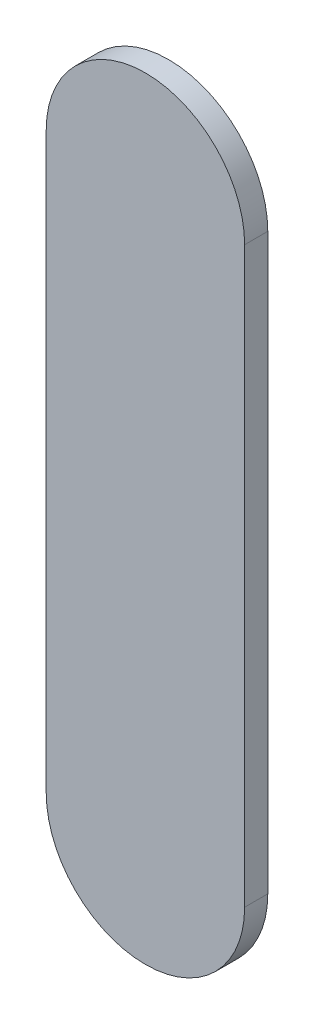
ISO-10303-21;
HEADER;
FILE_DESCRIPTION(('STEP AP214'),'2;1');
FILE_NAME('part.step','',(''),(''),'','','');
FILE_SCHEMA(('AUTOMOTIVE_DESIGN { 1 0 10303 214 1 1 1 1 }'));
ENDSEC;
DATA;
#1=APPLICATION_CONTEXT('core data for automotive mechanical design processes');
#2=APPLICATION_PROTOCOL_DEFINITION('international standard','automotive_design',2000,#1);
#3=PRODUCT_CONTEXT('',#1,'mechanical');
#4=PRODUCT('Part','Part','',(#3));
#5=PRODUCT_RELATED_PRODUCT_CATEGORY('part','',(#4));
#6=PRODUCT_DEFINITION_FORMATION('','',#4);
#7=PRODUCT_DEFINITION_CONTEXT('part definition',#1,'design');
#8=PRODUCT_DEFINITION('design','',#6,#7);
#9=PRODUCT_DEFINITION_SHAPE('','',#8);
#10=(LENGTH_UNIT() NAMED_UNIT(*) SI_UNIT(.MILLI.,.METRE.));
#11=(NAMED_UNIT(*) PLANE_ANGLE_UNIT() SI_UNIT($,.RADIAN.));
#12=(NAMED_UNIT(*) SI_UNIT($,.STERADIAN.) SOLID_ANGLE_UNIT());
#13=UNCERTAINTY_MEASURE_WITH_UNIT(LENGTH_MEASURE(1.E-05),#10,'distance_accuracy_value','');
#14=(GEOMETRIC_REPRESENTATION_CONTEXT(3) GLOBAL_UNCERTAINTY_ASSIGNED_CONTEXT((#13)) GLOBAL_UNIT_ASSIGNED_CONTEXT((#10,
#11,#12)) REPRESENTATION_CONTEXT('',''));
#15=CARTESIAN_POINT('',(0.,0.,0.));
#16=DIRECTION('',(0.,0.,1.));
#17=DIRECTION('',(1.,0.,0.));
#18=AXIS2_PLACEMENT_3D('',#15,#16,#17);
#19=CARTESIAN_POINT('',(125.15,-61.5875,1.635));
#20=DIRECTION('',(0.,0.,1.));
#21=DIRECTION('',(1.,0.,0.));
#22=AXIS2_PLACEMENT_3D('',#19,#20,#21);
#23=PLANE('',#22);
#24=DIRECTION('',(0.,1.,0.));
#25=VECTOR('',#24,1.);
#26=CARTESIAN_POINT('',(125.15,-61.5875,1.635));
#27=LINE('',#26,#25);
#28=CARTESIAN_POINT('',(125.15,-61.5875,1.635));
#29=VERTEX_POINT('',#28);
#30=CARTESIAN_POINT('',(125.15,-60.72,1.635));
#31=VERTEX_POINT('',#30);
#32=EDGE_CURVE('E89',#29,#31,#27,.T.);
#33=ORIENTED_EDGE('',*,*,#32,.T.);
#34=CARTESIAN_POINT('',(125.,-60.72,1.635));
#35=DIRECTION('',(0.,0.,1.));
#36=DIRECTION('',(1.,0.,0.));
#37=AXIS2_PLACEMENT_3D('',#34,#35,#36);
#38=CIRCLE('',#37,0.15);
#39=CARTESIAN_POINT('',(124.85,-60.72,1.635));
#40=VERTEX_POINT('',#39);
#41=EDGE_CURVE('E105',#31,#40,#38,.T.);
#42=ORIENTED_EDGE('',*,*,#41,.T.);
#43=DIRECTION('',(0.,-1.,0.));
#44=VECTOR('',#43,1.);
#45=CARTESIAN_POINT('',(124.85,-60.72,1.635));
#46=LINE('',#45,#44);
#47=CARTESIAN_POINT('',(124.85,-61.5875,1.635));
#48=VERTEX_POINT('',#47);
#49=EDGE_CURVE('E51',#40,#48,#46,.T.);
#50=ORIENTED_EDGE('',*,*,#49,.T.);
#51=CARTESIAN_POINT('',(125.,-61.5875,1.635));
#52=DIRECTION('',(0.,0.,1.));
#53=DIRECTION('',(-1.,0.,0.));
#54=AXIS2_PLACEMENT_3D('',#51,#52,#53);
#55=CIRCLE('',#54,0.15);
#56=EDGE_CURVE('E11',#48,#29,#55,.T.);
#57=ORIENTED_EDGE('',*,*,#56,.T.);
#58=EDGE_LOOP('',(#33,#42,#50,#57));
#59=FACE_BOUND('',#58,.T.);
#60=ADVANCED_FACE('F17',(#59),#23,.T.);
#61=CARTESIAN_POINT('',(125.15,-61.5875,1.6));
#62=DIRECTION('',(0.,0.,1.));
#63=DIRECTION('',(1.,0.,0.));
#64=AXIS2_PLACEMENT_3D('',#61,#62,#63);
#65=PLANE('',#64);
#66=CARTESIAN_POINT('',(125.,-61.5875,1.6));
#67=DIRECTION('',(0.,0.,1.));
#68=DIRECTION('',(-1.,0.,0.));
#69=AXIS2_PLACEMENT_3D('',#66,#67,#68);
#70=CIRCLE('',#69,0.15);
#71=CARTESIAN_POINT('',(124.85,-61.5875,1.6));
#72=VERTEX_POINT('',#71);
#73=CARTESIAN_POINT('',(125.15,-61.5875,1.6));
#74=VERTEX_POINT('',#73);
#75=EDGE_CURVE('E27',#72,#74,#70,.T.);
#76=ORIENTED_EDGE('',*,*,#75,.F.);
#77=DIRECTION('',(0.,-1.,0.));
#78=VECTOR('',#77,1.);
#79=CARTESIAN_POINT('',(124.85,-60.72,1.6));
#80=LINE('',#79,#78);
#81=CARTESIAN_POINT('',(124.85,-60.72,1.6));
#82=VERTEX_POINT('',#81);
#83=EDGE_CURVE('E20',#82,#72,#80,.T.);
#84=ORIENTED_EDGE('',*,*,#83,.F.);
#85=CARTESIAN_POINT('',(125.,-60.72,1.6));
#86=DIRECTION('',(0.,0.,1.));
#87=DIRECTION('',(1.,0.,0.));
#88=AXIS2_PLACEMENT_3D('',#85,#86,#87);
#89=CIRCLE('',#88,0.15);
#90=CARTESIAN_POINT('',(125.15,-60.72,1.6));
#91=VERTEX_POINT('',#90);
#92=EDGE_CURVE('E91',#91,#82,#89,.T.);
#93=ORIENTED_EDGE('',*,*,#92,.F.);
#94=DIRECTION('',(0.,1.,0.));
#95=VECTOR('',#94,1.);
#96=CARTESIAN_POINT('',(125.15,-61.5875,1.6));
#97=LINE('',#96,#95);
#98=EDGE_CURVE('E88',#74,#91,#97,.T.);
#99=ORIENTED_EDGE('',*,*,#98,.F.);
#100=EDGE_LOOP('',(#76,#84,#93,#99));
#101=FACE_BOUND('',#100,.T.);
#102=ADVANCED_FACE('F93',(#101),#65,.F.);
#103=CARTESIAN_POINT('',(125.,-61.5875,1.6));
#104=DIRECTION('',(0.,0.,-1.));
#105=DIRECTION('',(-1.,0.,0.));
#106=AXIS2_PLACEMENT_3D('',#103,#104,#105);
#107=CYLINDRICAL_SURFACE('',#106,0.15);
#108=ORIENTED_EDGE('',*,*,#75,.T.);
#109=DIRECTION('',(0.,0.,1.));
#110=VECTOR('',#109,1.);
#111=CARTESIAN_POINT('',(125.15,-61.5875,1.6));
#112=LINE('',#111,#110);
#113=EDGE_CURVE('E78',#74,#29,#112,.T.);
#114=ORIENTED_EDGE('',*,*,#113,.T.);
#115=ORIENTED_EDGE('',*,*,#56,.F.);
#116=DIRECTION('',(0.,0.,1.));
#117=VECTOR('',#116,1.);
#118=CARTESIAN_POINT('',(124.85,-61.5875,1.6));
#119=LINE('',#118,#117);
#120=EDGE_CURVE('E80',#72,#48,#119,.T.);
#121=ORIENTED_EDGE('',*,*,#120,.F.);
#122=EDGE_LOOP('',(#108,#114,#115,#121));
#123=FACE_BOUND('',#122,.T.);
#124=ADVANCED_FACE('F77',(#123),#107,.T.);
#125=CARTESIAN_POINT('',(124.85,-60.72,1.6));
#126=DIRECTION('',(1.,0.,0.));
#127=DIRECTION('',(0.,1.,0.));
#128=AXIS2_PLACEMENT_3D('',#125,#126,#127);
#129=PLANE('',#128);
#130=ORIENTED_EDGE('',*,*,#83,.T.);
#131=ORIENTED_EDGE('',*,*,#120,.T.);
#132=ORIENTED_EDGE('',*,*,#49,.F.);
#133=DIRECTION('',(0.,0.,1.));
#134=VECTOR('',#133,1.);
#135=CARTESIAN_POINT('',(124.85,-60.72,1.6));
#136=LINE('',#135,#134);
#137=EDGE_CURVE('E112',#82,#40,#136,.T.);
#138=ORIENTED_EDGE('',*,*,#137,.F.);
#139=EDGE_LOOP('',(#130,#131,#132,#138));
#140=FACE_BOUND('',#139,.T.);
#141=ADVANCED_FACE('F129',(#140),#129,.F.);
#142=CARTESIAN_POINT('',(125.,-60.72,1.6));
#143=DIRECTION('',(0.,0.,-1.));
#144=DIRECTION('',(1.,0.,0.));
#145=AXIS2_PLACEMENT_3D('',#142,#143,#144);
#146=CYLINDRICAL_SURFACE('',#145,0.15);
#147=ORIENTED_EDGE('',*,*,#92,.T.);
#148=ORIENTED_EDGE('',*,*,#137,.T.);
#149=ORIENTED_EDGE('',*,*,#41,.F.);
#150=DIRECTION('',(0.,0.,1.));
#151=VECTOR('',#150,1.);
#152=CARTESIAN_POINT('',(125.15,-60.72,1.6));
#153=LINE('',#152,#151);
#154=EDGE_CURVE('E97',#91,#31,#153,.T.);
#155=ORIENTED_EDGE('',*,*,#154,.F.);
#156=EDGE_LOOP('',(#147,#148,#149,#155));
#157=FACE_BOUND('',#156,.T.);
#158=ADVANCED_FACE('F128',(#157),#146,.T.);
#159=CARTESIAN_POINT('',(125.15,-61.5875,1.6));
#160=DIRECTION('',(-1.,0.,0.));
#161=DIRECTION('',(0.,0.,1.));
#162=AXIS2_PLACEMENT_3D('',#159,#160,#161);
#163=PLANE('',#162);
#164=ORIENTED_EDGE('',*,*,#98,.T.);
#165=ORIENTED_EDGE('',*,*,#154,.T.);
#166=ORIENTED_EDGE('',*,*,#32,.F.);
#167=ORIENTED_EDGE('',*,*,#113,.F.);
#168=EDGE_LOOP('',(#164,#165,#166,#167));
#169=FACE_BOUND('',#168,.T.);
#170=ADVANCED_FACE('F86',(#169),#163,.F.);
#171=CLOSED_SHELL('',(#60,#102,#124,#141,#158,#170));
#172=MANIFOLD_SOLID_BREP('B1',#171);
#173=ADVANCED_BREP_SHAPE_REPRESENTATION('',(#18,#172),#14);
#174=SHAPE_DEFINITION_REPRESENTATION(#9,#173);
ENDSEC;
END-ISO-10303-21;
